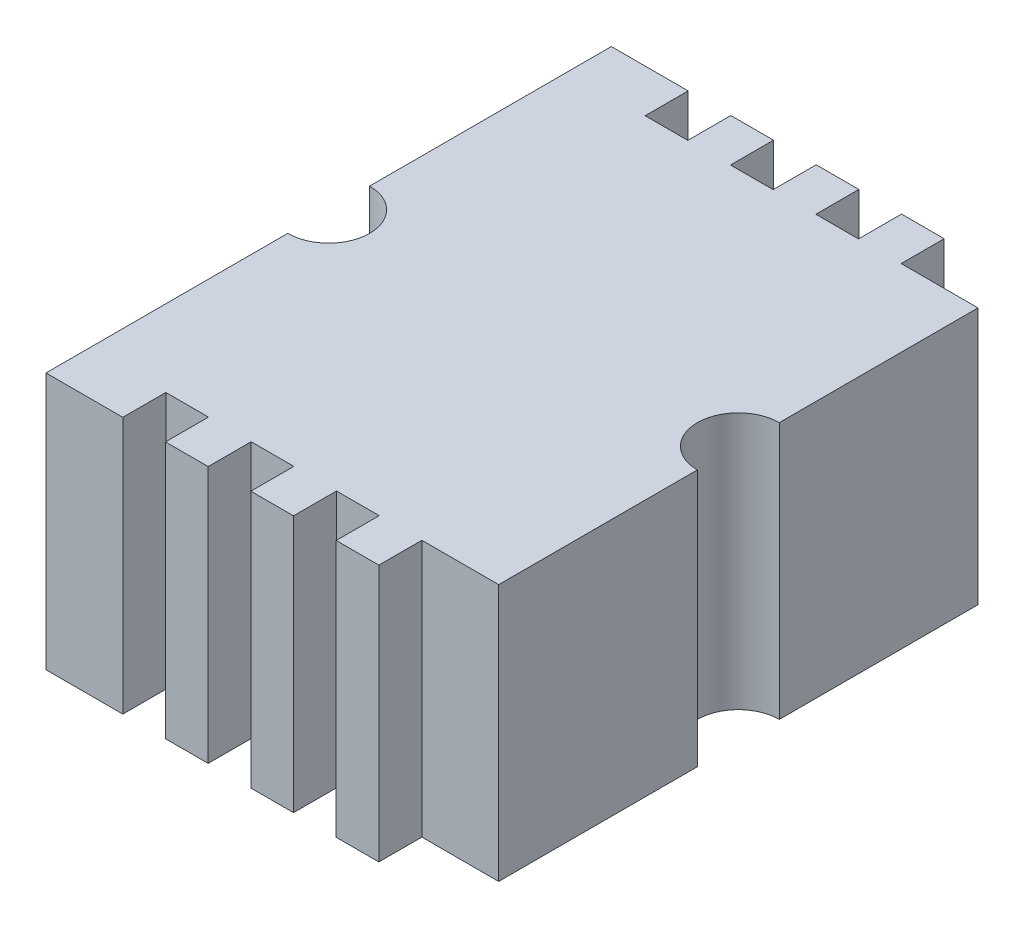
ISO-10303-21;
HEADER;
FILE_DESCRIPTION(('STEP AP214'),'2;1');
FILE_NAME('part.step','',(''),(''),'','','');
FILE_SCHEMA(('AUTOMOTIVE_DESIGN { 1 0 10303 214 1 1 1 1 }'));
ENDSEC;
DATA;
#1=APPLICATION_CONTEXT('core data for automotive mechanical design processes');
#2=APPLICATION_PROTOCOL_DEFINITION('international standard','automotive_design',2000,#1);
#3=PRODUCT_CONTEXT('',#1,'mechanical');
#4=PRODUCT('Part','Part','',(#3));
#5=PRODUCT_RELATED_PRODUCT_CATEGORY('part','',(#4));
#6=PRODUCT_DEFINITION_FORMATION('','',#4);
#7=PRODUCT_DEFINITION_CONTEXT('part definition',#1,'design');
#8=PRODUCT_DEFINITION('design','',#6,#7);
#9=PRODUCT_DEFINITION_SHAPE('','',#8);
#10=(LENGTH_UNIT() NAMED_UNIT(*) SI_UNIT(.MILLI.,.METRE.));
#11=(NAMED_UNIT(*) PLANE_ANGLE_UNIT() SI_UNIT($,.RADIAN.));
#12=(NAMED_UNIT(*) SI_UNIT($,.STERADIAN.) SOLID_ANGLE_UNIT());
#13=UNCERTAINTY_MEASURE_WITH_UNIT(LENGTH_MEASURE(1.E-05),#10,'distance_accuracy_value','');
#14=(GEOMETRIC_REPRESENTATION_CONTEXT(3) GLOBAL_UNCERTAINTY_ASSIGNED_CONTEXT((#13)) GLOBAL_UNIT_ASSIGNED_CONTEXT((#10,
#11,#12)) REPRESENTATION_CONTEXT('',''));
#15=CARTESIAN_POINT('',(0.,0.,0.));
#16=DIRECTION('',(0.,0.,1.));
#17=DIRECTION('',(1.,0.,0.));
#18=AXIS2_PLACEMENT_3D('',#15,#16,#17);
#19=CARTESIAN_POINT('',(-10.,20.,0.));
#20=DIRECTION('',(0.,-1.,0.));
#21=DIRECTION('',(0.,0.,-1.));
#22=AXIS2_PLACEMENT_3D('',#19,#20,#21);
#23=CYLINDRICAL_SURFACE('',#22,2.);
#24=DIRECTION('',(0.,-1.,0.));
#25=VECTOR('',#24,1.);
#26=CARTESIAN_POINT('',(-10.,20.,-2.));
#27=LINE('',#26,#25);
#28=CARTESIAN_POINT('',(-10.,7.45,-2.));
#29=VERTEX_POINT('',#28);
#30=CARTESIAN_POINT('',(-10.,20.,-2.));
#31=VERTEX_POINT('',#30);
#32=EDGE_CURVE('E322',#29,#31,#27,.F.);
#33=ORIENTED_EDGE('',*,*,#32,.F.);
#34=CARTESIAN_POINT('',(-10.,7.45,0.));
#35=DIRECTION('',(0.,-1.,0.));
#36=DIRECTION('',(0.,0.,-1.));
#37=AXIS2_PLACEMENT_3D('',#34,#35,#36);
#38=CIRCLE('',#37,2.);
#39=CARTESIAN_POINT('',(-10.,7.45,2.));
#40=VERTEX_POINT('',#39);
#41=EDGE_CURVE('E502',#29,#40,#38,.T.);
#42=ORIENTED_EDGE('',*,*,#41,.T.);
#43=DIRECTION('',(0.,-1.,0.));
#44=VECTOR('',#43,1.);
#45=CARTESIAN_POINT('',(-10.,20.,2.));
#46=LINE('',#45,#44);
#47=CARTESIAN_POINT('',(-10.,20.,2.));
#48=VERTEX_POINT('',#47);
#49=EDGE_CURVE('E324',#48,#40,#46,.T.);
#50=ORIENTED_EDGE('',*,*,#49,.F.);
#51=CARTESIAN_POINT('',(-10.,20.,0.));
#52=DIRECTION('',(0.,1.,0.));
#53=DIRECTION('',(0.,0.,1.));
#54=AXIS2_PLACEMENT_3D('',#51,#52,#53);
#55=CIRCLE('',#54,2.);
#56=EDGE_CURVE('E11',#48,#31,#55,.T.);
#57=ORIENTED_EDGE('',*,*,#56,.T.);
#58=EDGE_LOOP('',(#33,#42,#50,#57));
#59=FACE_BOUND('',#58,.T.);
#60=ADVANCED_FACE('F35',(#59),#23,.F.);
#61=CARTESIAN_POINT('',(10.,20.,0.));
#62=DIRECTION('',(0.,-1.,0.));
#63=DIRECTION('',(0.,0.,-1.));
#64=AXIS2_PLACEMENT_3D('',#61,#62,#63);
#65=CYLINDRICAL_SURFACE('',#64,2.);
#66=DIRECTION('',(0.,-1.,0.));
#67=VECTOR('',#66,1.);
#68=CARTESIAN_POINT('',(10.,20.,2.));
#69=LINE('',#68,#67);
#70=CARTESIAN_POINT('',(10.,20.,2.));
#71=VERTEX_POINT('',#70);
#72=CARTESIAN_POINT('',(10.,7.45,2.00000000000001));
#73=VERTEX_POINT('',#72);
#74=EDGE_CURVE('E313',#71,#73,#69,.T.);
#75=ORIENTED_EDGE('',*,*,#74,.T.);
#76=CARTESIAN_POINT('',(10.,7.45,0.));
#77=DIRECTION('',(0.,-1.,0.));
#78=DIRECTION('',(0.,0.,-1.));
#79=AXIS2_PLACEMENT_3D('',#76,#77,#78);
#80=CIRCLE('',#79,2.);
#81=CARTESIAN_POINT('',(10.,7.45,-2.00000000000001));
#82=VERTEX_POINT('',#81);
#83=EDGE_CURVE('E519',#73,#82,#80,.T.);
#84=ORIENTED_EDGE('',*,*,#83,.T.);
#85=DIRECTION('',(0.,-1.,0.));
#86=VECTOR('',#85,1.);
#87=CARTESIAN_POINT('',(10.,20.,-2.));
#88=LINE('',#87,#86);
#89=CARTESIAN_POINT('',(10.,20.,-2.));
#90=VERTEX_POINT('',#89);
#91=EDGE_CURVE('E290',#82,#90,#88,.F.);
#92=ORIENTED_EDGE('',*,*,#91,.T.);
#93=CARTESIAN_POINT('',(10.,20.,0.));
#94=DIRECTION('',(0.,1.,0.));
#95=DIRECTION('',(0.,0.,1.));
#96=AXIS2_PLACEMENT_3D('',#93,#94,#95);
#97=CIRCLE('',#96,2.);
#98=EDGE_CURVE('E43',#90,#71,#97,.T.);
#99=ORIENTED_EDGE('',*,*,#98,.T.);
#100=EDGE_LOOP('',(#75,#84,#92,#99));
#101=FACE_BOUND('',#100,.T.);
#102=ADVANCED_FACE('F553',(#101),#65,.F.);
#103=CARTESIAN_POINT('',(10.,0.,14.701));
#104=DIRECTION('',(-1.,0.,0.));
#105=DIRECTION('',(0.,-1.,0.));
#106=AXIS2_PLACEMENT_3D('',#103,#104,#105);
#107=PLANE('',#106);
#108=DIRECTION('',(0.,0.,1.));
#109=VECTOR('',#108,1.);
#110=CARTESIAN_POINT('',(10.,7.45,-14.7));
#111=LINE('',#110,#109);
#112=CARTESIAN_POINT('',(10.,7.45,11.7));
#113=VERTEX_POINT('',#112);
#114=EDGE_CURVE('E292',#73,#113,#111,.T.);
#115=ORIENTED_EDGE('',*,*,#114,.F.);
#116=ORIENTED_EDGE('',*,*,#74,.F.);
#117=DIRECTION('',(0.,0.,-1.));
#118=VECTOR('',#117,1.);
#119=CARTESIAN_POINT('',(10.,20.,14.701));
#120=LINE('',#119,#118);
#121=CARTESIAN_POINT('',(10.,20.,11.7));
#122=VERTEX_POINT('',#121);
#123=EDGE_CURVE('E316',#122,#71,#120,.T.);
#124=ORIENTED_EDGE('',*,*,#123,.F.);
#125=DIRECTION('',(0.,1.,0.));
#126=VECTOR('',#125,1.);
#127=CARTESIAN_POINT('',(10.,0.,11.7));
#128=LINE('',#127,#126);
#129=EDGE_CURVE('E305',#113,#122,#128,.T.);
#130=ORIENTED_EDGE('',*,*,#129,.F.);
#131=EDGE_LOOP('',(#115,#116,#124,#130));
#132=FACE_BOUND('',#131,.T.);
#133=ADVANCED_FACE('F528',(#132),#107,.F.);
#134=CARTESIAN_POINT('',(10.,7.45,-11.7));
#135=VERTEX_POINT('',#134);
#136=EDGE_CURVE('E271',#135,#82,#111,.T.);
#137=ORIENTED_EDGE('',*,*,#136,.F.);
#138=DIRECTION('',(0.,1.,0.));
#139=VECTOR('',#138,1.);
#140=CARTESIAN_POINT('',(10.,0.,-11.7));
#141=LINE('',#140,#139);
#142=CARTESIAN_POINT('',(10.,20.,-11.7));
#143=VERTEX_POINT('',#142);
#144=EDGE_CURVE('E288',#135,#143,#141,.T.);
#145=ORIENTED_EDGE('',*,*,#144,.T.);
#146=EDGE_CURVE('E317',#90,#143,#120,.T.);
#147=ORIENTED_EDGE('',*,*,#146,.F.);
#148=ORIENTED_EDGE('',*,*,#91,.F.);
#149=EDGE_LOOP('',(#137,#145,#147,#148));
#150=FACE_BOUND('',#149,.T.);
#151=ADVANCED_FACE('F286',(#150),#107,.F.);
#152=CARTESIAN_POINT('',(-10.,0.,14.701));
#153=DIRECTION('',(-1.,0.,0.));
#154=DIRECTION('',(0.,0.,1.));
#155=AXIS2_PLACEMENT_3D('',#152,#153,#154);
#156=PLANE('',#155);
#157=ORIENTED_EDGE('',*,*,#49,.T.);
#158=DIRECTION('',(0.,0.,-1.));
#159=VECTOR('',#158,1.);
#160=CARTESIAN_POINT('',(-10.,7.45,-14.7));
#161=LINE('',#160,#159);
#162=CARTESIAN_POINT('',(-10.,7.45,13.8));
#163=VERTEX_POINT('',#162);
#164=EDGE_CURVE('E521',#163,#40,#161,.T.);
#165=ORIENTED_EDGE('',*,*,#164,.F.);
#166=DIRECTION('',(0.,1.,0.));
#167=VECTOR('',#166,1.);
#168=CARTESIAN_POINT('',(-10.,-500000.,13.8));
#169=LINE('',#168,#167);
#170=CARTESIAN_POINT('',(-10.,20.,13.8));
#171=VERTEX_POINT('',#170);
#172=EDGE_CURVE('E506',#163,#171,#169,.T.);
#173=ORIENTED_EDGE('',*,*,#172,.T.);
#174=DIRECTION('',(0.,0.,-1.));
#175=VECTOR('',#174,1.);
#176=CARTESIAN_POINT('',(-10.,20.,14.701));
#177=LINE('',#176,#175);
#178=EDGE_CURVE('E319',#171,#48,#177,.T.);
#179=ORIENTED_EDGE('',*,*,#178,.T.);
#180=EDGE_LOOP('',(#157,#165,#173,#179));
#181=FACE_BOUND('',#180,.T.);
#182=ADVANCED_FACE('F621',(#181),#156,.T.);
#183=DIRECTION('',(0.,1.,0.));
#184=VECTOR('',#183,1.);
#185=CARTESIAN_POINT('',(-10.,-500000.,-13.8));
#186=LINE('',#185,#184);
#187=CARTESIAN_POINT('',(-10.,7.45,-13.8));
#188=VERTEX_POINT('',#187);
#189=CARTESIAN_POINT('',(-10.,20.,-13.8));
#190=VERTEX_POINT('',#189);
#191=EDGE_CURVE('E413',#188,#190,#186,.T.);
#192=ORIENTED_EDGE('',*,*,#191,.F.);
#193=EDGE_CURVE('E291',#29,#188,#161,.T.);
#194=ORIENTED_EDGE('',*,*,#193,.F.);
#195=ORIENTED_EDGE('',*,*,#32,.T.);
#196=EDGE_CURVE('E320',#31,#190,#177,.T.);
#197=ORIENTED_EDGE('',*,*,#196,.T.);
#198=EDGE_LOOP('',(#192,#194,#195,#197));
#199=FACE_BOUND('',#198,.T.);
#200=ADVANCED_FACE('F623',(#199),#156,.T.);
#201=CARTESIAN_POINT('',(0.,0.,11.7));
#202=DIRECTION('',(0.,0.,1.));
#203=DIRECTION('',(-1.,0.,0.));
#204=AXIS2_PLACEMENT_3D('',#201,#202,#203);
#205=PLANE('',#204);
#206=DIRECTION('',(0.,1.,0.));
#207=VECTOR('',#206,1.);
#208=CARTESIAN_POINT('',(-6.25000000000002,-500000.,11.7));
#209=LINE('',#208,#207);
#210=CARTESIAN_POINT('',(-6.25000000000002,7.45000000000573,11.7));
#211=VERTEX_POINT('',#210);
#212=CARTESIAN_POINT('',(-6.25000000000002,20.,11.7));
#213=VERTEX_POINT('',#212);
#214=EDGE_CURVE('E509',#211,#213,#209,.T.);
#215=ORIENTED_EDGE('',*,*,#214,.F.);
#216=DIRECTION('',(-1.,0.,0.));
#217=VECTOR('',#216,1.);
#218=CARTESIAN_POINT('',(0.,7.45,11.7));
#219=LINE('',#218,#217);
#220=CARTESIAN_POINT('',(-4.16666666666668,7.45,11.7));
#221=VERTEX_POINT('',#220);
#222=EDGE_CURVE('E311',#221,#211,#219,.T.);
#223=ORIENTED_EDGE('',*,*,#222,.F.);
#224=DIRECTION('',(0.,1.,0.));
#225=VECTOR('',#224,1.);
#226=CARTESIAN_POINT('',(-4.16666666666668,-500000.,11.7));
#227=LINE('',#226,#225);
#228=CARTESIAN_POINT('',(-4.16666666666668,20.,11.7));
#229=VERTEX_POINT('',#228);
#230=EDGE_CURVE('E481',#221,#229,#227,.T.);
#231=ORIENTED_EDGE('',*,*,#230,.T.);
#232=DIRECTION('',(1.,0.,0.));
#233=VECTOR('',#232,1.);
#234=CARTESIAN_POINT('',(0.,20.,11.7));
#235=LINE('',#234,#233);
#236=EDGE_CURVE('E301',#213,#229,#235,.T.);
#237=ORIENTED_EDGE('',*,*,#236,.F.);
#238=EDGE_LOOP('',(#215,#223,#231,#237));
#239=FACE_BOUND('',#238,.T.);
#240=ADVANCED_FACE('F618',(#239),#205,.T.);
#241=DIRECTION('',(0.,1.,0.));
#242=VECTOR('',#241,1.);
#243=CARTESIAN_POINT('',(-2.08333333333334,-500000.,11.7));
#244=LINE('',#243,#242);
#245=CARTESIAN_POINT('',(-2.08333333333334,7.45000000000573,11.7));
#246=VERTEX_POINT('',#245);
#247=CARTESIAN_POINT('',(-2.08333333333334,20.,11.7));
#248=VERTEX_POINT('',#247);
#249=EDGE_CURVE('E484',#246,#248,#244,.T.);
#250=ORIENTED_EDGE('',*,*,#249,.F.);
#251=CARTESIAN_POINT('',(0.,7.45,11.7));
#252=VERTEX_POINT('',#251);
#253=EDGE_CURVE('E984',#252,#246,#219,.T.);
#254=ORIENTED_EDGE('',*,*,#253,.F.);
#255=DIRECTION('',(0.,1.,0.));
#256=VECTOR('',#255,1.);
#257=CARTESIAN_POINT('',(0.,-500000.,11.7));
#258=LINE('',#257,#256);
#259=CARTESIAN_POINT('',(0.,20.,11.7));
#260=VERTEX_POINT('',#259);
#261=EDGE_CURVE('E457',#252,#260,#258,.T.);
#262=ORIENTED_EDGE('',*,*,#261,.T.);
#263=EDGE_CURVE('E303',#248,#260,#235,.T.);
#264=ORIENTED_EDGE('',*,*,#263,.F.);
#265=EDGE_LOOP('',(#250,#254,#262,#264));
#266=FACE_BOUND('',#265,.T.);
#267=ADVANCED_FACE('F844',(#266),#205,.T.);
#268=DIRECTION('',(0.,1.,0.));
#269=VECTOR('',#268,1.);
#270=CARTESIAN_POINT('',(2.08333333333333,-500000.,11.7));
#271=LINE('',#270,#269);
#272=CARTESIAN_POINT('',(2.08333333333333,7.45000000000573,11.7));
#273=VERTEX_POINT('',#272);
#274=CARTESIAN_POINT('',(2.08333333333333,20.,11.7));
#275=VERTEX_POINT('',#274);
#276=EDGE_CURVE('E460',#273,#275,#271,.T.);
#277=ORIENTED_EDGE('',*,*,#276,.F.);
#278=CARTESIAN_POINT('',(4.16666666666667,7.45,11.7));
#279=VERTEX_POINT('',#278);
#280=EDGE_CURVE('E310',#279,#273,#219,.T.);
#281=ORIENTED_EDGE('',*,*,#280,.F.);
#282=DIRECTION('',(0.,1.,0.));
#283=VECTOR('',#282,1.);
#284=CARTESIAN_POINT('',(4.16666666666667,-500000.,11.7));
#285=LINE('',#284,#283);
#286=CARTESIAN_POINT('',(4.16666666666667,20.,11.7));
#287=VERTEX_POINT('',#286);
#288=EDGE_CURVE('E432',#279,#287,#285,.T.);
#289=ORIENTED_EDGE('',*,*,#288,.T.);
#290=EDGE_CURVE('E548',#275,#287,#235,.T.);
#291=ORIENTED_EDGE('',*,*,#290,.F.);
#292=EDGE_LOOP('',(#277,#281,#289,#291));
#293=FACE_BOUND('',#292,.T.);
#294=ADVANCED_FACE('F614',(#293),#205,.T.);
#295=CARTESIAN_POINT('',(0.,0.,-11.7));
#296=DIRECTION('',(0.,0.,-1.));
#297=DIRECTION('',(-1.,0.,0.));
#298=AXIS2_PLACEMENT_3D('',#295,#296,#297);
#299=PLANE('',#298);
#300=DIRECTION('',(-1.,0.,0.));
#301=VECTOR('',#300,1.);
#302=CARTESIAN_POINT('',(0.,7.45,-11.7));
#303=LINE('',#302,#301);
#304=CARTESIAN_POINT('',(-4.16666666666668,7.45,-11.7));
#305=VERTEX_POINT('',#304);
#306=CARTESIAN_POINT('',(-6.25000000000002,7.45000000000573,-11.7));
#307=VERTEX_POINT('',#306);
#308=EDGE_CURVE('E282',#305,#307,#303,.T.);
#309=ORIENTED_EDGE('',*,*,#308,.T.);
#310=DIRECTION('',(0.,1.,0.));
#311=VECTOR('',#310,1.);
#312=CARTESIAN_POINT('',(-6.25000000000002,-500000.,-11.7));
#313=LINE('',#312,#311);
#314=CARTESIAN_POINT('',(-6.25000000000002,20.,-11.7));
#315=VERTEX_POINT('',#314);
#316=EDGE_CURVE('E416',#307,#315,#313,.T.);
#317=ORIENTED_EDGE('',*,*,#316,.T.);
#318=DIRECTION('',(1.,0.,0.));
#319=VECTOR('',#318,1.);
#320=CARTESIAN_POINT('',(0.,20.,-11.7));
#321=LINE('',#320,#319);
#322=CARTESIAN_POINT('',(-4.16666666666668,20.,-11.7));
#323=VERTEX_POINT('',#322);
#324=EDGE_CURVE('E295',#315,#323,#321,.T.);
#325=ORIENTED_EDGE('',*,*,#324,.T.);
#326=DIRECTION('',(0.,1.,0.));
#327=VECTOR('',#326,1.);
#328=CARTESIAN_POINT('',(-4.16666666666668,-500000.,-11.7));
#329=LINE('',#328,#327);
#330=EDGE_CURVE('E390',#305,#323,#329,.T.);
#331=ORIENTED_EDGE('',*,*,#330,.F.);
#332=EDGE_LOOP('',(#309,#317,#325,#331));
#333=FACE_BOUND('',#332,.T.);
#334=ADVANCED_FACE('F611',(#333),#299,.T.);
#335=CARTESIAN_POINT('',(0.,7.45,-11.7));
#336=VERTEX_POINT('',#335);
#337=CARTESIAN_POINT('',(-2.08333333333334,7.45000000000573,-11.7));
#338=VERTEX_POINT('',#337);
#339=EDGE_CURVE('E955',#336,#338,#303,.T.);
#340=ORIENTED_EDGE('',*,*,#339,.T.);
#341=DIRECTION('',(0.,1.,0.));
#342=VECTOR('',#341,1.);
#343=CARTESIAN_POINT('',(-2.08333333333334,-500000.,-11.7));
#344=LINE('',#343,#342);
#345=CARTESIAN_POINT('',(-2.08333333333334,20.,-11.7));
#346=VERTEX_POINT('',#345);
#347=EDGE_CURVE('E387',#338,#346,#344,.T.);
#348=ORIENTED_EDGE('',*,*,#347,.T.);
#349=CARTESIAN_POINT('',(0.,20.,-11.7));
#350=VERTEX_POINT('',#349);
#351=EDGE_CURVE('E298',#346,#350,#321,.T.);
#352=ORIENTED_EDGE('',*,*,#351,.T.);
#353=DIRECTION('',(0.,1.,0.));
#354=VECTOR('',#353,1.);
#355=CARTESIAN_POINT('',(0.,-500000.,-11.7));
#356=LINE('',#355,#354);
#357=EDGE_CURVE('E363',#336,#350,#356,.T.);
#358=ORIENTED_EDGE('',*,*,#357,.F.);
#359=EDGE_LOOP('',(#340,#348,#352,#358));
#360=FACE_BOUND('',#359,.T.);
#361=ADVANCED_FACE('F575',(#360),#299,.T.);
#362=CARTESIAN_POINT('',(4.16666666666667,7.45,-11.7));
#363=VERTEX_POINT('',#362);
#364=CARTESIAN_POINT('',(2.08333333333333,7.45000000000573,-11.7));
#365=VERTEX_POINT('',#364);
#366=EDGE_CURVE('E280',#363,#365,#303,.T.);
#367=ORIENTED_EDGE('',*,*,#366,.T.);
#368=DIRECTION('',(0.,1.,0.));
#369=VECTOR('',#368,1.);
#370=CARTESIAN_POINT('',(2.08333333333333,-500000.,-11.7));
#371=LINE('',#370,#369);
#372=CARTESIAN_POINT('',(2.08333333333333,20.,-11.7));
#373=VERTEX_POINT('',#372);
#374=EDGE_CURVE('E360',#365,#373,#371,.T.);
#375=ORIENTED_EDGE('',*,*,#374,.T.);
#376=CARTESIAN_POINT('',(4.16666666666667,20.,-11.7));
#377=VERTEX_POINT('',#376);
#378=EDGE_CURVE('E556',#373,#377,#321,.T.);
#379=ORIENTED_EDGE('',*,*,#378,.T.);
#380=DIRECTION('',(0.,1.,0.));
#381=VECTOR('',#380,1.);
#382=CARTESIAN_POINT('',(4.16666666666667,-500000.,-11.7));
#383=LINE('',#382,#381);
#384=EDGE_CURVE('E336',#363,#377,#383,.T.);
#385=ORIENTED_EDGE('',*,*,#384,.F.);
#386=EDGE_LOOP('',(#367,#375,#379,#385));
#387=FACE_BOUND('',#386,.T.);
#388=ADVANCED_FACE('F570',(#387),#299,.T.);
#389=CARTESIAN_POINT('',(6.25000000000001,7.45000000000573,-11.7));
#390=VERTEX_POINT('',#389);
#391=EDGE_CURVE('E268',#135,#390,#303,.T.);
#392=ORIENTED_EDGE('',*,*,#391,.T.);
#393=DIRECTION('',(0.,1.,0.));
#394=VECTOR('',#393,1.);
#395=CARTESIAN_POINT('',(6.25000000000001,-500000.,-11.7));
#396=LINE('',#395,#394);
#397=CARTESIAN_POINT('',(6.25000000000001,20.,-11.7));
#398=VERTEX_POINT('',#397);
#399=EDGE_CURVE('E334',#390,#398,#396,.T.);
#400=ORIENTED_EDGE('',*,*,#399,.T.);
#401=EDGE_CURVE('E279',#398,#143,#321,.T.);
#402=ORIENTED_EDGE('',*,*,#401,.T.);
#403=ORIENTED_EDGE('',*,*,#144,.F.);
#404=EDGE_LOOP('',(#392,#400,#402,#403));
#405=FACE_BOUND('',#404,.T.);
#406=ADVANCED_FACE('F294',(#405),#299,.T.);
#407=CARTESIAN_POINT('',(0.,20.,0.));
#408=DIRECTION('',(0.,1.,0.));
#409=DIRECTION('',(0.,0.,1.));
#410=AXIS2_PLACEMENT_3D('',#407,#408,#409);
#411=PLANE('',#410);
#412=ORIENTED_EDGE('',*,*,#324,.F.);
#413=DIRECTION('',(0.,0.,1.));
#414=VECTOR('',#413,1.);
#415=CARTESIAN_POINT('',(-6.25000000000002,20.,0.));
#416=LINE('',#415,#414);
#417=CARTESIAN_POINT('',(-6.25000000000002,20.,-13.8));
#418=VERTEX_POINT('',#417);
#419=EDGE_CURVE('E421',#418,#315,#416,.T.);
#420=ORIENTED_EDGE('',*,*,#419,.F.);
#421=DIRECTION('',(-1.,0.,0.));
#422=VECTOR('',#421,1.);
#423=CARTESIAN_POINT('',(0.,20.,-13.8));
#424=LINE('',#423,#422);
#425=EDGE_CURVE('E418',#418,#190,#424,.T.);
#426=ORIENTED_EDGE('',*,*,#425,.T.);
#427=ORIENTED_EDGE('',*,*,#196,.F.);
#428=ORIENTED_EDGE('',*,*,#56,.F.);
#429=ORIENTED_EDGE('',*,*,#178,.F.);
#430=DIRECTION('',(-1.,0.,0.));
#431=VECTOR('',#430,1.);
#432=CARTESIAN_POINT('',(0.,20.,13.8));
#433=LINE('',#432,#431);
#434=CARTESIAN_POINT('',(-6.25000000000002,20.,13.8));
#435=VERTEX_POINT('',#434);
#436=EDGE_CURVE('E505',#435,#171,#433,.T.);
#437=ORIENTED_EDGE('',*,*,#436,.F.);
#438=DIRECTION('',(0.,0.,-1.));
#439=VECTOR('',#438,1.);
#440=CARTESIAN_POINT('',(-6.25000000000002,20.,0.));
#441=LINE('',#440,#439);
#442=EDGE_CURVE('E478',#435,#213,#441,.T.);
#443=ORIENTED_EDGE('',*,*,#442,.T.);
#444=ORIENTED_EDGE('',*,*,#236,.T.);
#445=DIRECTION('',(0.,0.,-1.));
#446=VECTOR('',#445,1.);
#447=CARTESIAN_POINT('',(-4.16666666666668,20.,0.));
#448=LINE('',#447,#446);
#449=CARTESIAN_POINT('',(-4.16666666666668,20.,13.8));
#450=VERTEX_POINT('',#449);
#451=EDGE_CURVE('E491',#450,#229,#448,.T.);
#452=ORIENTED_EDGE('',*,*,#451,.F.);
#453=DIRECTION('',(-1.,0.,0.));
#454=VECTOR('',#453,1.);
#455=CARTESIAN_POINT('',(0.,20.,13.8));
#456=LINE('',#455,#454);
#457=CARTESIAN_POINT('',(-2.08333333333334,20.,13.8));
#458=VERTEX_POINT('',#457);
#459=EDGE_CURVE('E454',#458,#450,#456,.T.);
#460=ORIENTED_EDGE('',*,*,#459,.F.);
#461=DIRECTION('',(0.,0.,-1.));
#462=VECTOR('',#461,1.);
#463=CARTESIAN_POINT('',(-2.08333333333334,20.,0.));
#464=LINE('',#463,#462);
#465=EDGE_CURVE('E50',#458,#248,#464,.T.);
#466=ORIENTED_EDGE('',*,*,#465,.T.);
#467=ORIENTED_EDGE('',*,*,#263,.T.);
#468=DIRECTION('',(0.,0.,-1.));
#469=VECTOR('',#468,1.);
#470=CARTESIAN_POINT('',(0.,20.,0.));
#471=LINE('',#470,#469);
#472=CARTESIAN_POINT('',(0.,20.,13.8));
#473=VERTEX_POINT('',#472);
#474=EDGE_CURVE('E467',#473,#260,#471,.T.);
#475=ORIENTED_EDGE('',*,*,#474,.F.);
#476=DIRECTION('',(-1.,0.,0.));
#477=VECTOR('',#476,1.);
#478=CARTESIAN_POINT('',(0.,20.,13.8));
#479=LINE('',#478,#477);
#480=CARTESIAN_POINT('',(2.08333333333333,20.,13.8));
#481=VERTEX_POINT('',#480);
#482=EDGE_CURVE('E428',#481,#473,#479,.T.);
#483=ORIENTED_EDGE('',*,*,#482,.F.);
#484=DIRECTION('',(0.,0.,-1.));
#485=VECTOR('',#484,1.);
#486=CARTESIAN_POINT('',(2.08333333333333,20.,0.));
#487=LINE('',#486,#485);
#488=EDGE_CURVE('E57',#481,#275,#487,.T.);
#489=ORIENTED_EDGE('',*,*,#488,.T.);
#490=ORIENTED_EDGE('',*,*,#290,.T.);
#491=DIRECTION('',(0.,0.,-1.));
#492=VECTOR('',#491,1.);
#493=CARTESIAN_POINT('',(4.16666666666667,20.,0.));
#494=LINE('',#493,#492);
#495=CARTESIAN_POINT('',(4.16666666666667,20.,13.8));
#496=VERTEX_POINT('',#495);
#497=EDGE_CURVE('E443',#496,#287,#494,.T.);
#498=ORIENTED_EDGE('',*,*,#497,.F.);
#499=DIRECTION('',(-1.,0.,0.));
#500=VECTOR('',#499,1.);
#501=CARTESIAN_POINT('',(0.,20.,13.8));
#502=LINE('',#501,#500);
#503=CARTESIAN_POINT('',(6.25000000000001,20.,13.8));
#504=VERTEX_POINT('',#503);
#505=EDGE_CURVE('E424',#504,#496,#502,.T.);
#506=ORIENTED_EDGE('',*,*,#505,.F.);
#507=DIRECTION('',(0.,0.,-1.));
#508=VECTOR('',#507,1.);
#509=CARTESIAN_POINT('',(6.25000000000001,20.,0.));
#510=LINE('',#509,#508);
#511=CARTESIAN_POINT('',(6.25000000000001,20.,11.7));
#512=VERTEX_POINT('',#511);
#513=EDGE_CURVE('E431',#504,#512,#510,.T.);
#514=ORIENTED_EDGE('',*,*,#513,.T.);
#515=EDGE_CURVE('E304',#512,#122,#235,.T.);
#516=ORIENTED_EDGE('',*,*,#515,.T.);
#517=ORIENTED_EDGE('',*,*,#123,.T.);
#518=ORIENTED_EDGE('',*,*,#98,.F.);
#519=ORIENTED_EDGE('',*,*,#146,.T.);
#520=ORIENTED_EDGE('',*,*,#401,.F.);
#521=DIRECTION('',(0.,0.,1.));
#522=VECTOR('',#521,1.);
#523=CARTESIAN_POINT('',(6.25000000000001,20.,0.));
#524=LINE('',#523,#522);
#525=CARTESIAN_POINT('',(6.25000000000001,20.,-13.8));
#526=VERTEX_POINT('',#525);
#527=EDGE_CURVE('E333',#526,#398,#524,.T.);
#528=ORIENTED_EDGE('',*,*,#527,.F.);
#529=DIRECTION('',(-1.,0.,0.));
#530=VECTOR('',#529,1.);
#531=CARTESIAN_POINT('',(0.,20.,-13.8));
#532=LINE('',#531,#530);
#533=CARTESIAN_POINT('',(4.16666666666667,20.,-13.8));
#534=VERTEX_POINT('',#533);
#535=EDGE_CURVE('E327',#526,#534,#532,.T.);
#536=ORIENTED_EDGE('',*,*,#535,.T.);
#537=DIRECTION('',(0.,0.,1.));
#538=VECTOR('',#537,1.);
#539=CARTESIAN_POINT('',(4.16666666666667,20.,0.));
#540=LINE('',#539,#538);
#541=EDGE_CURVE('E344',#534,#377,#540,.T.);
#542=ORIENTED_EDGE('',*,*,#541,.T.);
#543=ORIENTED_EDGE('',*,*,#378,.F.);
#544=DIRECTION('',(0.,0.,1.));
#545=VECTOR('',#544,1.);
#546=CARTESIAN_POINT('',(2.08333333333333,20.,0.));
#547=LINE('',#546,#545);
#548=CARTESIAN_POINT('',(2.08333333333333,20.,-13.8));
#549=VERTEX_POINT('',#548);
#550=EDGE_CURVE('E359',#549,#373,#547,.T.);
#551=ORIENTED_EDGE('',*,*,#550,.F.);
#552=DIRECTION('',(-1.,0.,0.));
#553=VECTOR('',#552,1.);
#554=CARTESIAN_POINT('',(0.,20.,-13.8));
#555=LINE('',#554,#553);
#556=CARTESIAN_POINT('',(0.,20.,-13.8));
#557=VERTEX_POINT('',#556);
#558=EDGE_CURVE('E330',#549,#557,#555,.T.);
#559=ORIENTED_EDGE('',*,*,#558,.T.);
#560=DIRECTION('',(0.,0.,1.));
#561=VECTOR('',#560,1.);
#562=CARTESIAN_POINT('',(0.,20.,0.));
#563=LINE('',#562,#561);
#564=EDGE_CURVE('E371',#557,#350,#563,.T.);
#565=ORIENTED_EDGE('',*,*,#564,.T.);
#566=ORIENTED_EDGE('',*,*,#351,.F.);
#567=DIRECTION('',(0.,0.,1.));
#568=VECTOR('',#567,1.);
#569=CARTESIAN_POINT('',(-2.08333333333334,20.,0.));
#570=LINE('',#569,#568);
#571=CARTESIAN_POINT('',(-2.08333333333334,20.,-13.8));
#572=VERTEX_POINT('',#571);
#573=EDGE_CURVE('E386',#572,#346,#570,.T.);
#574=ORIENTED_EDGE('',*,*,#573,.F.);
#575=DIRECTION('',(-1.,0.,0.));
#576=VECTOR('',#575,1.);
#577=CARTESIAN_POINT('',(0.,20.,-13.8));
#578=LINE('',#577,#576);
#579=CARTESIAN_POINT('',(-4.16666666666668,20.,-13.8));
#580=VERTEX_POINT('',#579);
#581=EDGE_CURVE('E356',#572,#580,#578,.T.);
#582=ORIENTED_EDGE('',*,*,#581,.T.);
#583=DIRECTION('',(0.,0.,1.));
#584=VECTOR('',#583,1.);
#585=CARTESIAN_POINT('',(-4.16666666666668,20.,0.));
#586=LINE('',#585,#584);
#587=EDGE_CURVE('E398',#580,#323,#586,.T.);
#588=ORIENTED_EDGE('',*,*,#587,.T.);
#589=EDGE_LOOP('',(#412,#420,#426,#427,#428,#429,#437,#443,#444,#452,#460,#466,#467,#475,#483,
#489,#490,#498,#506,#514,#516,#517,#518,#519,#520,#528,#536,#542,#543,#551,#559,#565,#566,#574,
#582,#588));
#590=FACE_BOUND('',#589,.T.);
#591=ADVANCED_FACE('F37',(#590),#411,.T.);
#592=DIRECTION('',(0.,1.,0.));
#593=VECTOR('',#592,1.);
#594=CARTESIAN_POINT('',(6.25000000000001,-500000.,11.7));
#595=LINE('',#594,#593);
#596=CARTESIAN_POINT('',(6.25000000000001,7.45000000000573,11.7));
#597=VERTEX_POINT('',#596);
#598=EDGE_CURVE('E435',#597,#512,#595,.T.);
#599=ORIENTED_EDGE('',*,*,#598,.F.);
#600=EDGE_CURVE('E308',#113,#597,#219,.T.);
#601=ORIENTED_EDGE('',*,*,#600,.F.);
#602=ORIENTED_EDGE('',*,*,#129,.T.);
#603=ORIENTED_EDGE('',*,*,#515,.F.);
#604=EDGE_LOOP('',(#599,#601,#602,#603));
#605=FACE_BOUND('',#604,.T.);
#606=ADVANCED_FACE('F533',(#605),#205,.T.);
#607=CARTESIAN_POINT('',(6.25000000000001,-500000.,0.));
#608=DIRECTION('',(-1.,0.,0.));
#609=DIRECTION('',(0.,0.,1.));
#610=AXIS2_PLACEMENT_3D('',#607,#608,#609);
#611=PLANE('',#610);
#612=DIRECTION('',(0.,0.,1.));
#613=VECTOR('',#612,1.);
#614=CARTESIAN_POINT('',(6.25000000000001,7.45000000000573,0.));
#615=LINE('',#614,#613);
#616=CARTESIAN_POINT('',(6.25000000000001,7.45000000000573,-13.8));
#617=VERTEX_POINT('',#616);
#618=EDGE_CURVE('E274',#617,#390,#615,.T.);
#619=ORIENTED_EDGE('',*,*,#618,.F.);
#620=DIRECTION('',(0.,1.,0.));
#621=VECTOR('',#620,1.);
#622=CARTESIAN_POINT('',(6.25000000000001,-500000.,-13.8));
#623=LINE('',#622,#621);
#624=EDGE_CURVE('E331',#617,#526,#623,.T.);
#625=ORIENTED_EDGE('',*,*,#624,.T.);
#626=ORIENTED_EDGE('',*,*,#527,.T.);
#627=ORIENTED_EDGE('',*,*,#399,.F.);
#628=EDGE_LOOP('',(#619,#625,#626,#627));
#629=FACE_BOUND('',#628,.T.);
#630=ADVANCED_FACE('F558',(#629),#611,.F.);
#631=CARTESIAN_POINT('',(4.16666666666667,-500000.,0.));
#632=DIRECTION('',(-1.,0.,0.));
#633=DIRECTION('',(0.,0.,1.));
#634=AXIS2_PLACEMENT_3D('',#631,#632,#633);
#635=PLANE('',#634);
#636=DIRECTION('',(0.,1.,0.));
#637=VECTOR('',#636,1.);
#638=CARTESIAN_POINT('',(4.16666666666667,-500000.,-13.8));
#639=LINE('',#638,#637);
#640=CARTESIAN_POINT('',(4.16666666666667,7.45000000000573,-13.8));
#641=VERTEX_POINT('',#640);
#642=EDGE_CURVE('E339',#641,#534,#639,.T.);
#643=ORIENTED_EDGE('',*,*,#642,.F.);
#644=DIRECTION('',(0.,0.,1.));
#645=VECTOR('',#644,1.);
#646=CARTESIAN_POINT('',(4.16666666666667,7.45000000000573,0.));
#647=LINE('',#646,#645);
#648=EDGE_CURVE('E341',#641,#363,#647,.T.);
#649=ORIENTED_EDGE('',*,*,#648,.T.);
#650=ORIENTED_EDGE('',*,*,#384,.T.);
#651=ORIENTED_EDGE('',*,*,#541,.F.);
#652=EDGE_LOOP('',(#643,#649,#650,#651));
#653=FACE_BOUND('',#652,.T.);
#654=ADVANCED_FACE('F566',(#653),#635,.T.);
#655=CARTESIAN_POINT('',(0.,-500000.,-13.8));
#656=DIRECTION('',(0.,0.,-1.));
#657=DIRECTION('',(-1.,0.,0.));
#658=AXIS2_PLACEMENT_3D('',#655,#656,#657);
#659=PLANE('',#658);
#660=ORIENTED_EDGE('',*,*,#624,.F.);
#661=DIRECTION('',(-1.,0.,0.));
#662=VECTOR('',#661,1.);
#663=CARTESIAN_POINT('',(0.,7.45000000000573,-13.8));
#664=LINE('',#663,#662);
#665=EDGE_CURVE('E329',#617,#641,#664,.T.);
#666=ORIENTED_EDGE('',*,*,#665,.T.);
#667=ORIENTED_EDGE('',*,*,#642,.T.);
#668=ORIENTED_EDGE('',*,*,#535,.F.);
#669=EDGE_LOOP('',(#660,#666,#667,#668));
#670=FACE_BOUND('',#669,.T.);
#671=ADVANCED_FACE('F561',(#670),#659,.T.);
#672=CARTESIAN_POINT('',(2.08333333333333,-500000.,0.));
#673=DIRECTION('',(-1.,0.,0.));
#674=DIRECTION('',(0.,0.,1.));
#675=AXIS2_PLACEMENT_3D('',#672,#673,#674);
#676=PLANE('',#675);
#677=DIRECTION('',(0.,0.,1.));
#678=VECTOR('',#677,1.);
#679=CARTESIAN_POINT('',(2.08333333333333,7.45000000000573,0.));
#680=LINE('',#679,#678);
#681=CARTESIAN_POINT('',(2.08333333333333,7.45000000000573,-13.8));
#682=VERTEX_POINT('',#681);
#683=EDGE_CURVE('E353',#682,#365,#680,.T.);
#684=ORIENTED_EDGE('',*,*,#683,.F.);
#685=DIRECTION('',(0.,1.,0.));
#686=VECTOR('',#685,1.);
#687=CARTESIAN_POINT('',(2.08333333333333,-500000.,-13.8));
#688=LINE('',#687,#686);
#689=EDGE_CURVE('E357',#682,#549,#688,.T.);
#690=ORIENTED_EDGE('',*,*,#689,.T.);
#691=ORIENTED_EDGE('',*,*,#550,.T.);
#692=ORIENTED_EDGE('',*,*,#374,.F.);
#693=EDGE_LOOP('',(#684,#690,#691,#692));
#694=FACE_BOUND('',#693,.T.);
#695=ADVANCED_FACE('F588',(#694),#676,.F.);
#696=CARTESIAN_POINT('',(0.,-500000.,0.));
#697=DIRECTION('',(-1.,0.,0.));
#698=DIRECTION('',(0.,0.,1.));
#699=AXIS2_PLACEMENT_3D('',#696,#697,#698);
#700=PLANE('',#699);
#701=DIRECTION('',(0.,1.,0.));
#702=VECTOR('',#701,1.);
#703=CARTESIAN_POINT('',(0.,-500000.,-13.8));
#704=LINE('',#703,#702);
#705=CARTESIAN_POINT('',(0.,7.45000000000573,-13.8));
#706=VERTEX_POINT('',#705);
#707=EDGE_CURVE('E366',#706,#557,#704,.T.);
#708=ORIENTED_EDGE('',*,*,#707,.F.);
#709=DIRECTION('',(0.,0.,1.));
#710=VECTOR('',#709,1.);
#711=CARTESIAN_POINT('',(0.,7.45000000000573,0.));
#712=LINE('',#711,#710);
#713=EDGE_CURVE('E368',#706,#336,#712,.T.);
#714=ORIENTED_EDGE('',*,*,#713,.T.);
#715=ORIENTED_EDGE('',*,*,#357,.T.);
#716=ORIENTED_EDGE('',*,*,#564,.F.);
#717=EDGE_LOOP('',(#708,#714,#715,#716));
#718=FACE_BOUND('',#717,.T.);
#719=ADVANCED_FACE('F581',(#718),#700,.T.);
#720=CARTESIAN_POINT('',(0.,-500000.,-13.8));
#721=DIRECTION('',(0.,0.,-1.));
#722=DIRECTION('',(-1.,0.,0.));
#723=AXIS2_PLACEMENT_3D('',#720,#721,#722);
#724=PLANE('',#723);
#725=ORIENTED_EDGE('',*,*,#689,.F.);
#726=DIRECTION('',(-1.,0.,0.));
#727=VECTOR('',#726,1.);
#728=CARTESIAN_POINT('',(0.,7.45000000000573,-13.8));
#729=LINE('',#728,#727);
#730=EDGE_CURVE('E355',#682,#706,#729,.T.);
#731=ORIENTED_EDGE('',*,*,#730,.T.);
#732=ORIENTED_EDGE('',*,*,#707,.T.);
#733=ORIENTED_EDGE('',*,*,#558,.F.);
#734=EDGE_LOOP('',(#725,#731,#732,#733));
#735=FACE_BOUND('',#734,.T.);
#736=ADVANCED_FACE('F585',(#735),#724,.T.);
#737=CARTESIAN_POINT('',(-2.08333333333334,-500000.,0.));
#738=DIRECTION('',(-1.,0.,0.));
#739=DIRECTION('',(0.,0.,1.));
#740=AXIS2_PLACEMENT_3D('',#737,#738,#739);
#741=PLANE('',#740);
#742=DIRECTION('',(0.,0.,1.));
#743=VECTOR('',#742,1.);
#744=CARTESIAN_POINT('',(-2.08333333333334,7.45000000000573,0.));
#745=LINE('',#744,#743);
#746=CARTESIAN_POINT('',(-2.08333333333334,7.45000000000573,-13.8));
#747=VERTEX_POINT('',#746);
#748=EDGE_CURVE('E380',#747,#338,#745,.T.);
#749=ORIENTED_EDGE('',*,*,#748,.F.);
#750=DIRECTION('',(0.,1.,0.));
#751=VECTOR('',#750,1.);
#752=CARTESIAN_POINT('',(-2.08333333333334,-500000.,-13.8));
#753=LINE('',#752,#751);
#754=EDGE_CURVE('E384',#747,#572,#753,.T.);
#755=ORIENTED_EDGE('',*,*,#754,.T.);
#756=ORIENTED_EDGE('',*,*,#573,.T.);
#757=ORIENTED_EDGE('',*,*,#347,.F.);
#758=EDGE_LOOP('',(#749,#755,#756,#757));
#759=FACE_BOUND('',#758,.T.);
#760=ADVANCED_FACE('F631',(#759),#741,.F.);
#761=CARTESIAN_POINT('',(-4.16666666666668,-500000.,0.));
#762=DIRECTION('',(-1.,0.,0.));
#763=DIRECTION('',(0.,0.,1.));
#764=AXIS2_PLACEMENT_3D('',#761,#762,#763);
#765=PLANE('',#764);
#766=DIRECTION('',(0.,1.,0.));
#767=VECTOR('',#766,1.);
#768=CARTESIAN_POINT('',(-4.16666666666668,-500000.,-13.8));
#769=LINE('',#768,#767);
#770=CARTESIAN_POINT('',(-4.16666666666668,7.45000000000573,-13.8));
#771=VERTEX_POINT('',#770);
#772=EDGE_CURVE('E393',#771,#580,#769,.T.);
#773=ORIENTED_EDGE('',*,*,#772,.F.);
#774=DIRECTION('',(0.,0.,1.));
#775=VECTOR('',#774,1.);
#776=CARTESIAN_POINT('',(-4.16666666666668,7.45000000000573,0.));
#777=LINE('',#776,#775);
#778=EDGE_CURVE('E395',#771,#305,#777,.T.);
#779=ORIENTED_EDGE('',*,*,#778,.T.);
#780=ORIENTED_EDGE('',*,*,#330,.T.);
#781=ORIENTED_EDGE('',*,*,#587,.F.);
#782=EDGE_LOOP('',(#773,#779,#780,#781));
#783=FACE_BOUND('',#782,.T.);
#784=ADVANCED_FACE('F601',(#783),#765,.T.);
#785=CARTESIAN_POINT('',(0.,-500000.,-13.8));
#786=DIRECTION('',(0.,0.,-1.));
#787=DIRECTION('',(-1.,0.,0.));
#788=AXIS2_PLACEMENT_3D('',#785,#786,#787);
#789=PLANE('',#788);
#790=ORIENTED_EDGE('',*,*,#754,.F.);
#791=DIRECTION('',(-1.,0.,0.));
#792=VECTOR('',#791,1.);
#793=CARTESIAN_POINT('',(0.,7.45000000000573,-13.8));
#794=LINE('',#793,#792);
#795=EDGE_CURVE('E382',#747,#771,#794,.T.);
#796=ORIENTED_EDGE('',*,*,#795,.T.);
#797=ORIENTED_EDGE('',*,*,#772,.T.);
#798=ORIENTED_EDGE('',*,*,#581,.F.);
#799=EDGE_LOOP('',(#790,#796,#797,#798));
#800=FACE_BOUND('',#799,.T.);
#801=ADVANCED_FACE('F591',(#800),#789,.T.);
#802=CARTESIAN_POINT('',(0.,-500000.,-13.8));
#803=DIRECTION('',(0.,0.,-1.));
#804=DIRECTION('',(-1.,0.,0.));
#805=AXIS2_PLACEMENT_3D('',#802,#803,#804);
#806=PLANE('',#805);
#807=DIRECTION('',(0.,1.,0.));
#808=VECTOR('',#807,1.);
#809=CARTESIAN_POINT('',(-6.25000000000002,-500000.,-13.8));
#810=LINE('',#809,#808);
#811=CARTESIAN_POINT('',(-6.25000000000002,7.45000000000573,-13.8));
#812=VERTEX_POINT('',#811);
#813=EDGE_CURVE('E411',#812,#418,#810,.T.);
#814=ORIENTED_EDGE('',*,*,#813,.F.);
#815=DIRECTION('',(-1.,0.,0.));
#816=VECTOR('',#815,1.);
#817=CARTESIAN_POINT('',(0.,7.45000000000573,-13.8));
#818=LINE('',#817,#816);
#819=EDGE_CURVE('E408',#812,#188,#818,.T.);
#820=ORIENTED_EDGE('',*,*,#819,.T.);
#821=ORIENTED_EDGE('',*,*,#191,.T.);
#822=ORIENTED_EDGE('',*,*,#425,.F.);
#823=EDGE_LOOP('',(#814,#820,#821,#822));
#824=FACE_BOUND('',#823,.T.);
#825=ADVANCED_FACE('F600',(#824),#806,.T.);
#826=CARTESIAN_POINT('',(-6.25000000000002,-500000.,0.));
#827=DIRECTION('',(-1.,0.,0.));
#828=DIRECTION('',(0.,0.,1.));
#829=AXIS2_PLACEMENT_3D('',#826,#827,#828);
#830=PLANE('',#829);
#831=DIRECTION('',(0.,0.,1.));
#832=VECTOR('',#831,1.);
#833=CARTESIAN_POINT('',(-6.25000000000002,7.45000000000573,0.));
#834=LINE('',#833,#832);
#835=EDGE_CURVE('E383',#812,#307,#834,.T.);
#836=ORIENTED_EDGE('',*,*,#835,.F.);
#837=ORIENTED_EDGE('',*,*,#813,.T.);
#838=ORIENTED_EDGE('',*,*,#419,.T.);
#839=ORIENTED_EDGE('',*,*,#316,.F.);
#840=EDGE_LOOP('',(#836,#837,#838,#839));
#841=FACE_BOUND('',#840,.T.);
#842=ADVANCED_FACE('F637',(#841),#830,.F.);
#843=CARTESIAN_POINT('',(4.16666666666667,-500000.,0.));
#844=DIRECTION('',(1.,0.,0.));
#845=DIRECTION('',(0.,0.,-1.));
#846=AXIS2_PLACEMENT_3D('',#843,#844,#845);
#847=PLANE('',#846);
#848=ORIENTED_EDGE('',*,*,#288,.F.);
#849=DIRECTION('',(0.,0.,1.));
#850=VECTOR('',#849,1.);
#851=CARTESIAN_POINT('',(4.16666666666667,7.45000000000573,0.));
#852=LINE('',#851,#850);
#853=CARTESIAN_POINT('',(4.16666666666667,7.45000000000573,13.8));
#854=VERTEX_POINT('',#853);
#855=EDGE_CURVE('E440',#279,#854,#852,.T.);
#856=ORIENTED_EDGE('',*,*,#855,.T.);
#857=DIRECTION('',(0.,1.,0.));
#858=VECTOR('',#857,1.);
#859=CARTESIAN_POINT('',(4.16666666666667,-500000.,13.8));
#860=LINE('',#859,#858);
#861=EDGE_CURVE('E429',#854,#496,#860,.T.);
#862=ORIENTED_EDGE('',*,*,#861,.T.);
#863=ORIENTED_EDGE('',*,*,#497,.T.);
#864=EDGE_LOOP('',(#848,#856,#862,#863));
#865=FACE_BOUND('',#864,.T.);
#866=ADVANCED_FACE('F545',(#865),#847,.F.);
#867=CARTESIAN_POINT('',(6.25000000000001,-500000.,0.));
#868=DIRECTION('',(1.,0.,0.));
#869=DIRECTION('',(0.,0.,-1.));
#870=AXIS2_PLACEMENT_3D('',#867,#868,#869);
#871=PLANE('',#870);
#872=DIRECTION('',(0.,0.,1.));
#873=VECTOR('',#872,1.);
#874=CARTESIAN_POINT('',(6.25000000000001,7.45000000000573,0.));
#875=LINE('',#874,#873);
#876=CARTESIAN_POINT('',(6.25000000000001,7.45000000000573,13.8));
#877=VERTEX_POINT('',#876);
#878=EDGE_CURVE('E425',#597,#877,#875,.T.);
#879=ORIENTED_EDGE('',*,*,#878,.F.);
#880=ORIENTED_EDGE('',*,*,#598,.T.);
#881=ORIENTED_EDGE('',*,*,#513,.F.);
#882=DIRECTION('',(0.,1.,0.));
#883=VECTOR('',#882,1.);
#884=CARTESIAN_POINT('',(6.25000000000001,-500000.,13.8));
#885=LINE('',#884,#883);
#886=EDGE_CURVE('E438',#877,#504,#885,.T.);
#887=ORIENTED_EDGE('',*,*,#886,.F.);
#888=EDGE_LOOP('',(#879,#880,#881,#887));
#889=FACE_BOUND('',#888,.T.);
#890=ADVANCED_FACE('F536',(#889),#871,.T.);
#891=CARTESIAN_POINT('',(0.,-500000.,13.8));
#892=DIRECTION('',(0.,0.,-1.));
#893=DIRECTION('',(-1.,0.,0.));
#894=AXIS2_PLACEMENT_3D('',#891,#892,#893);
#895=PLANE('',#894);
#896=ORIENTED_EDGE('',*,*,#861,.F.);
#897=DIRECTION('',(1.,0.,0.));
#898=VECTOR('',#897,1.);
#899=CARTESIAN_POINT('',(0.,7.45000000000573,13.8));
#900=LINE('',#899,#898);
#901=EDGE_CURVE('E427',#854,#877,#900,.T.);
#902=ORIENTED_EDGE('',*,*,#901,.T.);
#903=ORIENTED_EDGE('',*,*,#886,.T.);
#904=ORIENTED_EDGE('',*,*,#505,.T.);
#905=EDGE_LOOP('',(#896,#902,#903,#904));
#906=FACE_BOUND('',#905,.T.);
#907=ADVANCED_FACE('F541',(#906),#895,.F.);
#908=CARTESIAN_POINT('',(0.,-500000.,0.));
#909=DIRECTION('',(1.,0.,0.));
#910=DIRECTION('',(0.,0.,-1.));
#911=AXIS2_PLACEMENT_3D('',#908,#909,#910);
#912=PLANE('',#911);
#913=ORIENTED_EDGE('',*,*,#261,.F.);
#914=DIRECTION('',(0.,0.,1.));
#915=VECTOR('',#914,1.);
#916=CARTESIAN_POINT('',(0.,7.45000000000573,0.));
#917=LINE('',#916,#915);
#918=CARTESIAN_POINT('',(0.,7.45000000000573,13.8));
#919=VERTEX_POINT('',#918);
#920=EDGE_CURVE('E464',#252,#919,#917,.T.);
#921=ORIENTED_EDGE('',*,*,#920,.T.);
#922=DIRECTION('',(0.,1.,0.));
#923=VECTOR('',#922,1.);
#924=CARTESIAN_POINT('',(0.,-500000.,13.8));
#925=LINE('',#924,#923);
#926=EDGE_CURVE('E455',#919,#473,#925,.T.);
#927=ORIENTED_EDGE('',*,*,#926,.T.);
#928=ORIENTED_EDGE('',*,*,#474,.T.);
#929=EDGE_LOOP('',(#913,#921,#927,#928));
#930=FACE_BOUND('',#929,.T.);
#931=ADVANCED_FACE('F661',(#930),#912,.F.);
#932=CARTESIAN_POINT('',(2.08333333333333,-500000.,0.));
#933=DIRECTION('',(1.,0.,0.));
#934=DIRECTION('',(0.,0.,-1.));
#935=AXIS2_PLACEMENT_3D('',#932,#933,#934);
#936=PLANE('',#935);
#937=DIRECTION('',(0.,0.,1.));
#938=VECTOR('',#937,1.);
#939=CARTESIAN_POINT('',(2.08333333333333,7.45000000000573,0.));
#940=LINE('',#939,#938);
#941=CARTESIAN_POINT('',(2.08333333333333,7.45000000000573,13.8));
#942=VERTEX_POINT('',#941);
#943=EDGE_CURVE('E451',#273,#942,#940,.T.);
#944=ORIENTED_EDGE('',*,*,#943,.F.);
#945=ORIENTED_EDGE('',*,*,#276,.T.);
#946=ORIENTED_EDGE('',*,*,#488,.F.);
#947=DIRECTION('',(0.,1.,0.));
#948=VECTOR('',#947,1.);
#949=CARTESIAN_POINT('',(2.08333333333333,-500000.,13.8));
#950=LINE('',#949,#948);
#951=EDGE_CURVE('E462',#942,#481,#950,.T.);
#952=ORIENTED_EDGE('',*,*,#951,.F.);
#953=EDGE_LOOP('',(#944,#945,#946,#952));
#954=FACE_BOUND('',#953,.T.);
#955=ADVANCED_FACE('F664',(#954),#936,.T.);
#956=CARTESIAN_POINT('',(0.,-500000.,13.8));
#957=DIRECTION('',(0.,0.,-1.));
#958=DIRECTION('',(-1.,0.,0.));
#959=AXIS2_PLACEMENT_3D('',#956,#957,#958);
#960=PLANE('',#959);
#961=ORIENTED_EDGE('',*,*,#926,.F.);
#962=DIRECTION('',(1.,0.,0.));
#963=VECTOR('',#962,1.);
#964=CARTESIAN_POINT('',(0.,7.45000000000573,13.8));
#965=LINE('',#964,#963);
#966=EDGE_CURVE('E453',#919,#942,#965,.T.);
#967=ORIENTED_EDGE('',*,*,#966,.T.);
#968=ORIENTED_EDGE('',*,*,#951,.T.);
#969=ORIENTED_EDGE('',*,*,#482,.T.);
#970=EDGE_LOOP('',(#961,#967,#968,#969));
#971=FACE_BOUND('',#970,.T.);
#972=ADVANCED_FACE('F652',(#971),#960,.F.);
#973=CARTESIAN_POINT('',(-4.16666666666668,-500000.,0.));
#974=DIRECTION('',(1.,0.,0.));
#975=DIRECTION('',(0.,0.,-1.));
#976=AXIS2_PLACEMENT_3D('',#973,#974,#975);
#977=PLANE('',#976);
#978=ORIENTED_EDGE('',*,*,#230,.F.);
#979=DIRECTION('',(0.,0.,1.));
#980=VECTOR('',#979,1.);
#981=CARTESIAN_POINT('',(-4.16666666666668,7.45000000000573,0.));
#982=LINE('',#981,#980);
#983=CARTESIAN_POINT('',(-4.16666666666668,7.45000000000573,13.8));
#984=VERTEX_POINT('',#983);
#985=EDGE_CURVE('E488',#221,#984,#982,.T.);
#986=ORIENTED_EDGE('',*,*,#985,.T.);
#987=DIRECTION('',(0.,1.,0.));
#988=VECTOR('',#987,1.);
#989=CARTESIAN_POINT('',(-4.16666666666668,-500000.,13.8));
#990=LINE('',#989,#988);
#991=EDGE_CURVE('E479',#984,#450,#990,.T.);
#992=ORIENTED_EDGE('',*,*,#991,.T.);
#993=ORIENTED_EDGE('',*,*,#451,.T.);
#994=EDGE_LOOP('',(#978,#986,#992,#993));
#995=FACE_BOUND('',#994,.T.);
#996=ADVANCED_FACE('F672',(#995),#977,.F.);
#997=CARTESIAN_POINT('',(-2.08333333333334,-500000.,0.));
#998=DIRECTION('',(1.,0.,0.));
#999=DIRECTION('',(0.,0.,-1.));
#1000=AXIS2_PLACEMENT_3D('',#997,#998,#999);
#1001=PLANE('',#1000);
#1002=DIRECTION('',(0.,0.,1.));
#1003=VECTOR('',#1002,1.);
#1004=CARTESIAN_POINT('',(-2.08333333333334,7.45000000000573,0.));
#1005=LINE('',#1004,#1003);
#1006=CARTESIAN_POINT('',(-2.08333333333334,7.45000000000573,13.8));
#1007=VERTEX_POINT('',#1006);
#1008=EDGE_CURVE('E475',#246,#1007,#1005,.T.);
#1009=ORIENTED_EDGE('',*,*,#1008,.F.);
#1010=ORIENTED_EDGE('',*,*,#249,.T.);
#1011=ORIENTED_EDGE('',*,*,#465,.F.);
#1012=DIRECTION('',(0.,1.,0.));
#1013=VECTOR('',#1012,1.);
#1014=CARTESIAN_POINT('',(-2.08333333333334,-500000.,13.8));
#1015=LINE('',#1014,#1013);
#1016=EDGE_CURVE('E486',#1007,#458,#1015,.T.);
#1017=ORIENTED_EDGE('',*,*,#1016,.F.);
#1018=EDGE_LOOP('',(#1009,#1010,#1011,#1017));
#1019=FACE_BOUND('',#1018,.T.);
#1020=ADVANCED_FACE('F676',(#1019),#1001,.T.);
#1021=CARTESIAN_POINT('',(0.,-500000.,13.8));
#1022=DIRECTION('',(0.,0.,-1.));
#1023=DIRECTION('',(-1.,0.,0.));
#1024=AXIS2_PLACEMENT_3D('',#1021,#1022,#1023);
#1025=PLANE('',#1024);
#1026=ORIENTED_EDGE('',*,*,#991,.F.);
#1027=DIRECTION('',(1.,0.,0.));
#1028=VECTOR('',#1027,1.);
#1029=CARTESIAN_POINT('',(0.,7.45000000000573,13.8));
#1030=LINE('',#1029,#1028);
#1031=EDGE_CURVE('E477',#984,#1007,#1030,.T.);
#1032=ORIENTED_EDGE('',*,*,#1031,.T.);
#1033=ORIENTED_EDGE('',*,*,#1016,.T.);
#1034=ORIENTED_EDGE('',*,*,#459,.T.);
#1035=EDGE_LOOP('',(#1026,#1032,#1033,#1034));
#1036=FACE_BOUND('',#1035,.T.);
#1037=ADVANCED_FACE('F666',(#1036),#1025,.F.);
#1038=CARTESIAN_POINT('',(0.,-500000.,13.8));
#1039=DIRECTION('',(0.,0.,-1.));
#1040=DIRECTION('',(-1.,0.,0.));
#1041=AXIS2_PLACEMENT_3D('',#1038,#1039,#1040);
#1042=PLANE('',#1041);
#1043=ORIENTED_EDGE('',*,*,#172,.F.);
#1044=DIRECTION('',(1.,0.,0.));
#1045=VECTOR('',#1044,1.);
#1046=CARTESIAN_POINT('',(0.,7.45000000000573,13.8));
#1047=LINE('',#1046,#1045);
#1048=CARTESIAN_POINT('',(-6.25000000000002,7.45000000000573,13.8));
#1049=VERTEX_POINT('',#1048);
#1050=EDGE_CURVE('E501',#163,#1049,#1047,.T.);
#1051=ORIENTED_EDGE('',*,*,#1050,.T.);
#1052=DIRECTION('',(0.,1.,0.));
#1053=VECTOR('',#1052,1.);
#1054=CARTESIAN_POINT('',(-6.25000000000002,-500000.,13.8));
#1055=LINE('',#1054,#1053);
#1056=EDGE_CURVE('E503',#1049,#435,#1055,.T.);
#1057=ORIENTED_EDGE('',*,*,#1056,.T.);
#1058=ORIENTED_EDGE('',*,*,#436,.T.);
#1059=EDGE_LOOP('',(#1043,#1051,#1057,#1058));
#1060=FACE_BOUND('',#1059,.T.);
#1061=ADVANCED_FACE('F684',(#1060),#1042,.F.);
#1062=CARTESIAN_POINT('',(-6.25000000000002,-500000.,0.));
#1063=DIRECTION('',(1.,0.,0.));
#1064=DIRECTION('',(0.,0.,-1.));
#1065=AXIS2_PLACEMENT_3D('',#1062,#1063,#1064);
#1066=PLANE('',#1065);
#1067=DIRECTION('',(0.,0.,1.));
#1068=VECTOR('',#1067,1.);
#1069=CARTESIAN_POINT('',(-6.25000000000002,7.45000000000573,0.));
#1070=LINE('',#1069,#1068);
#1071=EDGE_CURVE('E499',#211,#1049,#1070,.T.);
#1072=ORIENTED_EDGE('',*,*,#1071,.F.);
#1073=ORIENTED_EDGE('',*,*,#214,.T.);
#1074=ORIENTED_EDGE('',*,*,#442,.F.);
#1075=ORIENTED_EDGE('',*,*,#1056,.F.);
#1076=EDGE_LOOP('',(#1072,#1073,#1074,#1075));
#1077=FACE_BOUND('',#1076,.T.);
#1078=ADVANCED_FACE('F678',(#1077),#1066,.T.);
#1079=CARTESIAN_POINT('',(0.,7.45,0.));
#1080=DIRECTION('',(0.,-1.,0.));
#1081=DIRECTION('',(0.,0.,-1.));
#1082=AXIS2_PLACEMENT_3D('',#1079,#1080,#1081);
#1083=PLANE('',#1082);
#1084=ORIENTED_EDGE('',*,*,#193,.T.);
#1085=ORIENTED_EDGE('',*,*,#819,.F.);
#1086=ORIENTED_EDGE('',*,*,#835,.T.);
#1087=ORIENTED_EDGE('',*,*,#308,.F.);
#1088=ORIENTED_EDGE('',*,*,#778,.F.);
#1089=ORIENTED_EDGE('',*,*,#795,.F.);
#1090=ORIENTED_EDGE('',*,*,#748,.T.);
#1091=ORIENTED_EDGE('',*,*,#339,.F.);
#1092=ORIENTED_EDGE('',*,*,#713,.F.);
#1093=ORIENTED_EDGE('',*,*,#730,.F.);
#1094=ORIENTED_EDGE('',*,*,#683,.T.);
#1095=ORIENTED_EDGE('',*,*,#366,.F.);
#1096=ORIENTED_EDGE('',*,*,#648,.F.);
#1097=ORIENTED_EDGE('',*,*,#665,.F.);
#1098=ORIENTED_EDGE('',*,*,#618,.T.);
#1099=ORIENTED_EDGE('',*,*,#391,.F.);
#1100=ORIENTED_EDGE('',*,*,#136,.T.);
#1101=ORIENTED_EDGE('',*,*,#83,.F.);
#1102=ORIENTED_EDGE('',*,*,#114,.T.);
#1103=ORIENTED_EDGE('',*,*,#600,.T.);
#1104=ORIENTED_EDGE('',*,*,#878,.T.);
#1105=ORIENTED_EDGE('',*,*,#901,.F.);
#1106=ORIENTED_EDGE('',*,*,#855,.F.);
#1107=ORIENTED_EDGE('',*,*,#280,.T.);
#1108=ORIENTED_EDGE('',*,*,#943,.T.);
#1109=ORIENTED_EDGE('',*,*,#966,.F.);
#1110=ORIENTED_EDGE('',*,*,#920,.F.);
#1111=ORIENTED_EDGE('',*,*,#253,.T.);
#1112=ORIENTED_EDGE('',*,*,#1008,.T.);
#1113=ORIENTED_EDGE('',*,*,#1031,.F.);
#1114=ORIENTED_EDGE('',*,*,#985,.F.);
#1115=ORIENTED_EDGE('',*,*,#222,.T.);
#1116=ORIENTED_EDGE('',*,*,#1071,.T.);
#1117=ORIENTED_EDGE('',*,*,#1050,.F.);
#1118=ORIENTED_EDGE('',*,*,#164,.T.);
#1119=ORIENTED_EDGE('',*,*,#41,.F.);
#1120=EDGE_LOOP('',(#1084,#1085,#1086,#1087,#1088,#1089,#1090,#1091,#1092,#1093,#1094,#1095,
#1096,#1097,#1098,#1099,#1100,#1101,#1102,#1103,#1104,#1105,#1106,#1107,#1108,#1109,#1110,#1111,
#1112,#1113,#1114,#1115,#1116,#1117,#1118,#1119));
#1121=FACE_BOUND('',#1120,.T.);
#1122=ADVANCED_FACE('F270',(#1121),#1083,.T.);
#1123=CLOSED_SHELL('',(#60,#102,#133,#151,#182,#200,#240,#267,#294,#334,#361,#388,#406,#591,
#606,#630,#654,#671,#695,#719,#736,#760,#784,#801,#825,#842,#866,#890,#907,#931,#955,#972,#996,
#1020,#1037,#1061,#1078,#1122));
#1124=MANIFOLD_SOLID_BREP('B2',#1123);
#1125=ADVANCED_BREP_SHAPE_REPRESENTATION('',(#18,#1124),#14);
#1126=SHAPE_DEFINITION_REPRESENTATION(#9,#1125);
ENDSEC;
END-ISO-10303-21;
